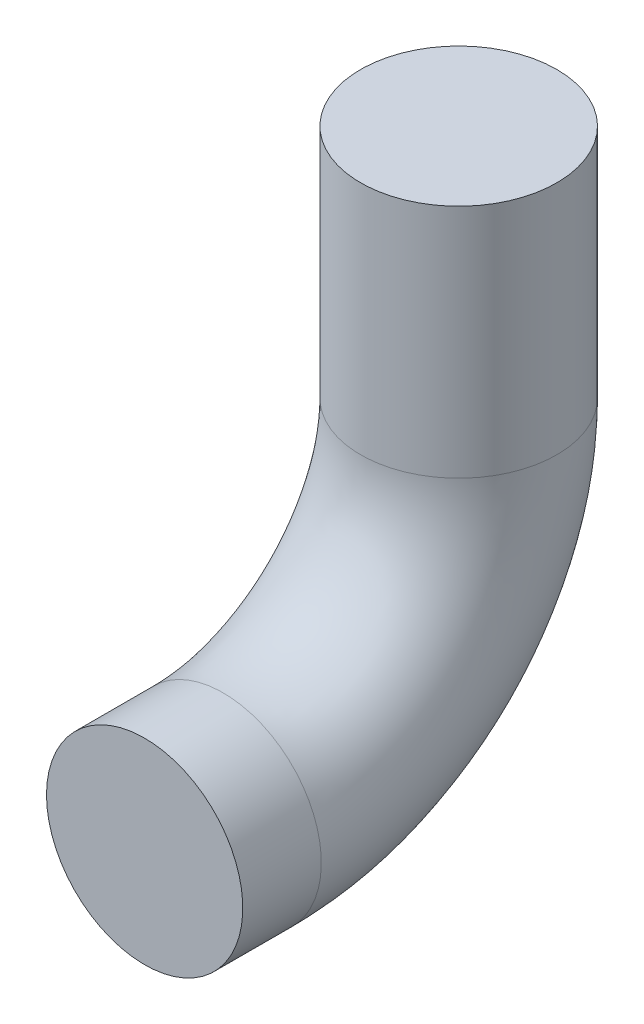
ISO-10303-21;
HEADER;
FILE_DESCRIPTION(('STEP AP214'),'2;1');
FILE_NAME('part.step','',(''),(''),'','','');
FILE_SCHEMA(('AUTOMOTIVE_DESIGN { 1 0 10303 214 1 1 1 1 }'));
ENDSEC;
DATA;
#1=APPLICATION_CONTEXT('core data for automotive mechanical design processes');
#2=APPLICATION_PROTOCOL_DEFINITION('international standard','automotive_design',2000,#1);
#3=PRODUCT_CONTEXT('',#1,'mechanical');
#4=PRODUCT('Part','Part','',(#3));
#5=PRODUCT_RELATED_PRODUCT_CATEGORY('part','',(#4));
#6=PRODUCT_DEFINITION_FORMATION('','',#4);
#7=PRODUCT_DEFINITION_CONTEXT('part definition',#1,'design');
#8=PRODUCT_DEFINITION('design','',#6,#7);
#9=PRODUCT_DEFINITION_SHAPE('','',#8);
#10=(LENGTH_UNIT() NAMED_UNIT(*) SI_UNIT(.MILLI.,.METRE.));
#11=(NAMED_UNIT(*) PLANE_ANGLE_UNIT() SI_UNIT($,.RADIAN.));
#12=(NAMED_UNIT(*) SI_UNIT($,.STERADIAN.) SOLID_ANGLE_UNIT());
#13=UNCERTAINTY_MEASURE_WITH_UNIT(LENGTH_MEASURE(1.E-05),#10,'distance_accuracy_value','');
#14=(GEOMETRIC_REPRESENTATION_CONTEXT(3) GLOBAL_UNCERTAINTY_ASSIGNED_CONTEXT((#13)) GLOBAL_UNIT_ASSIGNED_CONTEXT((#10,
#11,#12)) REPRESENTATION_CONTEXT('',''));
#15=CARTESIAN_POINT('',(0.,0.,0.));
#16=DIRECTION('',(0.,0.,1.));
#17=DIRECTION('',(1.,0.,0.));
#18=AXIS2_PLACEMENT_3D('',#15,#16,#17);
#19=CARTESIAN_POINT('',(0.,3.00000000000001,-2.99999999999999));
#20=DIRECTION('',(0.,1.,0.));
#21=DIRECTION('',(0.,0.,1.));
#22=AXIS2_PLACEMENT_3D('',#19,#20,#21);
#23=PLANE('',#22);
#24=CARTESIAN_POINT('',(0.,3.00000000000001,-2.99999999999999));
#25=DIRECTION('',(0.,-1.,0.));
#26=DIRECTION('',(0.,0.,-1.));
#27=AXIS2_PLACEMENT_3D('',#24,#25,#26);
#28=CIRCLE('',#27,1.25);
#29=CARTESIAN_POINT('',(0.,3.00000000000001,-4.24999999999999));
#30=VERTEX_POINT('',#29);
#31=EDGE_CURVE('E18',#30,#30,#28,.T.);
#32=ORIENTED_EDGE('',*,*,#31,.F.);
#33=EDGE_LOOP('',(#32));
#34=FACE_BOUND('',#33,.T.);
#35=ADVANCED_FACE('F15',(#34),#23,.T.);
#36=CARTESIAN_POINT('',(0.,-3.,1.));
#37=DIRECTION('',(0.,0.,1.));
#38=DIRECTION('',(1.,0.,0.));
#39=AXIS2_PLACEMENT_3D('',#36,#37,#38);
#40=PLANE('',#39);
#41=CARTESIAN_POINT('',(0.,-3.,1.));
#42=DIRECTION('',(0.,0.,-1.));
#43=DIRECTION('',(-1.,0.,0.));
#44=AXIS2_PLACEMENT_3D('',#41,#42,#43);
#45=CIRCLE('',#44,1.25);
#46=CARTESIAN_POINT('',(-1.25,-3.,1.));
#47=VERTEX_POINT('',#46);
#48=EDGE_CURVE('E27',#47,#47,#45,.T.);
#49=ORIENTED_EDGE('',*,*,#48,.F.);
#50=EDGE_LOOP('',(#49));
#51=FACE_BOUND('',#50,.T.);
#52=ADVANCED_FACE('F41',(#51),#40,.T.);
#53=CARTESIAN_POINT('',(0.,3.00000000000001,-2.99999999999999));
#54=DIRECTION('',(0.,-1.,0.));
#55=DIRECTION('',(0.,0.,-1.));
#56=AXIS2_PLACEMENT_3D('',#53,#54,#55);
#57=CYLINDRICAL_SURFACE('',#56,1.25);
#58=CARTESIAN_POINT('',(0.,0.,-3.));
#59=DIRECTION('',(0.,-1.,0.));
#60=DIRECTION('',(0.,0.,-1.));
#61=AXIS2_PLACEMENT_3D('',#58,#59,#60);
#62=CIRCLE('',#61,1.25);
#63=CARTESIAN_POINT('',(0.,0.,-4.25));
#64=VERTEX_POINT('',#63);
#65=EDGE_CURVE('E22',#64,#64,#62,.T.);
#66=ORIENTED_EDGE('',*,*,#65,.F.);
#67=EDGE_LOOP('',(#66));
#68=FACE_BOUND('',#67,.T.);
#69=ORIENTED_EDGE('',*,*,#31,.T.);
#70=EDGE_LOOP('',(#69));
#71=FACE_BOUND('',#70,.T.);
#72=ADVANCED_FACE('F38',(#68,#71),#57,.T.);
#73=CARTESIAN_POINT('',(0.,-3.,1.));
#74=DIRECTION('',(0.,0.,-1.));
#75=DIRECTION('',(-1.,0.,0.));
#76=AXIS2_PLACEMENT_3D('',#73,#74,#75);
#77=CYLINDRICAL_SURFACE('',#76,1.25);
#78=ORIENTED_EDGE('',*,*,#48,.T.);
#79=EDGE_LOOP('',(#78));
#80=FACE_BOUND('',#79,.T.);
#81=CARTESIAN_POINT('',(0.,-3.,0.));
#82=DIRECTION('',(0.,0.,1.));
#83=DIRECTION('',(0.,-1.,0.));
#84=AXIS2_PLACEMENT_3D('',#81,#82,#83);
#85=CIRCLE('',#84,1.25);
#86=CARTESIAN_POINT('',(0.,-4.25,0.));
#87=VERTEX_POINT('',#86);
#88=EDGE_CURVE('E10',#87,#87,#85,.F.);
#89=ORIENTED_EDGE('',*,*,#88,.F.);
#90=EDGE_LOOP('',(#89));
#91=FACE_BOUND('',#90,.T.);
#92=ADVANCED_FACE('F49',(#80,#91),#77,.T.);
#93=CARTESIAN_POINT('',(0.,0.,0.));
#94=DIRECTION('',(-1.,0.,0.));
#95=DIRECTION('',(0.,0.,1.));
#96=AXIS2_PLACEMENT_3D('',#93,#94,#95);
#97=TOROIDAL_SURFACE('',#96,3.,1.25);
#98=ORIENTED_EDGE('',*,*,#65,.T.);
#99=EDGE_LOOP('',(#98));
#100=FACE_BOUND('',#99,.T.);
#101=ORIENTED_EDGE('',*,*,#88,.T.);
#102=EDGE_LOOP('',(#101));
#103=FACE_BOUND('',#102,.T.);
#104=ADVANCED_FACE('F47',(#100,#103),#97,.T.);
#105=CLOSED_SHELL('',(#35,#52,#72,#92,#104));
#106=MANIFOLD_SOLID_BREP('B1',#105);
#107=ADVANCED_BREP_SHAPE_REPRESENTATION('',(#18,#106),#14);
#108=SHAPE_DEFINITION_REPRESENTATION(#9,#107);
ENDSEC;
END-ISO-10303-21;
